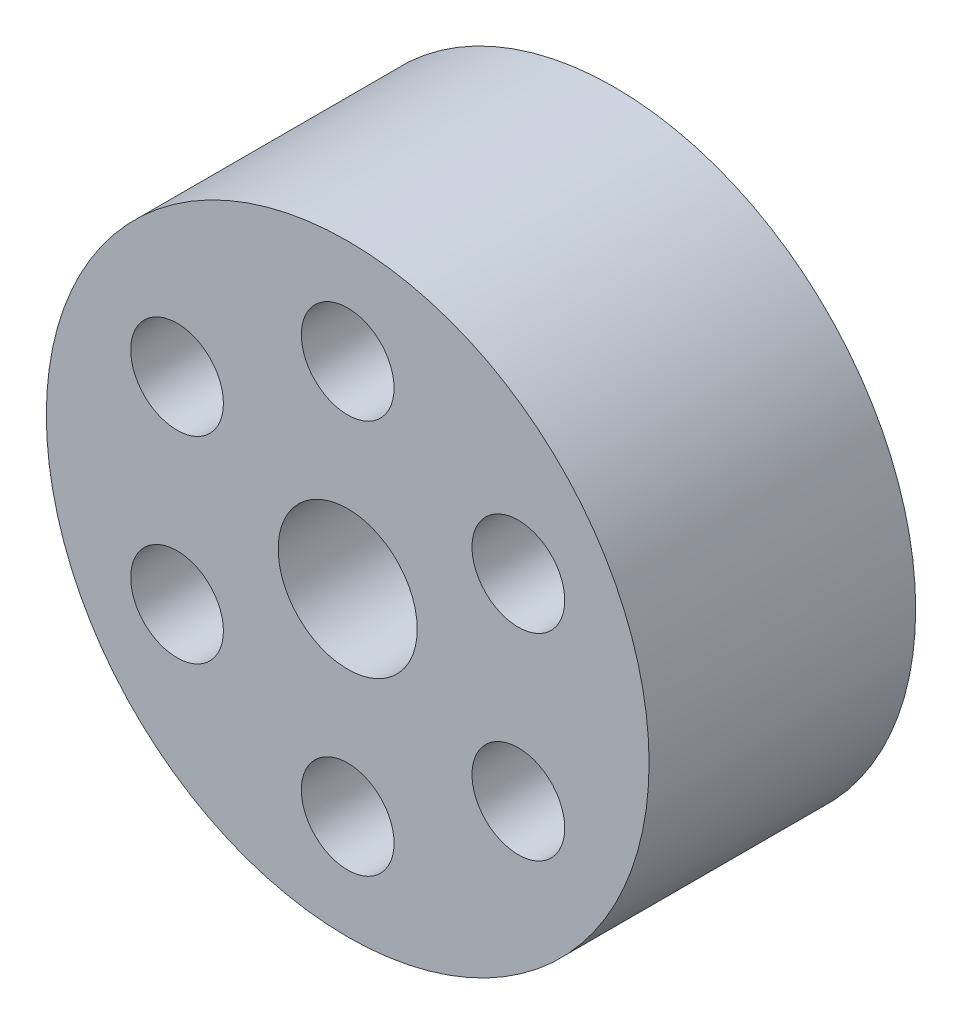
ISO-10303-21;
HEADER;
FILE_DESCRIPTION(('STEP AP214'),'2;1');
FILE_NAME('part.step','',(''),(''),'','','');
FILE_SCHEMA(('AUTOMOTIVE_DESIGN { 1 0 10303 214 1 1 1 1 }'));
ENDSEC;
DATA;
#1=APPLICATION_CONTEXT('core data for automotive mechanical design processes');
#2=APPLICATION_PROTOCOL_DEFINITION('international standard','automotive_design',2000,#1);
#3=PRODUCT_CONTEXT('',#1,'mechanical');
#4=PRODUCT('Part','Part','',(#3));
#5=PRODUCT_RELATED_PRODUCT_CATEGORY('part','',(#4));
#6=PRODUCT_DEFINITION_FORMATION('','',#4);
#7=PRODUCT_DEFINITION_CONTEXT('part definition',#1,'design');
#8=PRODUCT_DEFINITION('design','',#6,#7);
#9=PRODUCT_DEFINITION_SHAPE('','',#8);
#10=(LENGTH_UNIT() NAMED_UNIT(*) SI_UNIT(.MILLI.,.METRE.));
#11=(NAMED_UNIT(*) PLANE_ANGLE_UNIT() SI_UNIT($,.RADIAN.));
#12=(NAMED_UNIT(*) SI_UNIT($,.STERADIAN.) SOLID_ANGLE_UNIT());
#13=UNCERTAINTY_MEASURE_WITH_UNIT(LENGTH_MEASURE(1.E-05),#10,'distance_accuracy_value','');
#14=(GEOMETRIC_REPRESENTATION_CONTEXT(3) GLOBAL_UNCERTAINTY_ASSIGNED_CONTEXT((#13)) GLOBAL_UNIT_ASSIGNED_CONTEXT((#10,
#11,#12)) REPRESENTATION_CONTEXT('',''));
#15=CARTESIAN_POINT('',(0.,0.,0.));
#16=DIRECTION('',(0.,0.,1.));
#17=DIRECTION('',(1.,0.,0.));
#18=AXIS2_PLACEMENT_3D('',#15,#16,#17);
#19=CARTESIAN_POINT('',(0.,0.,11.5));
#20=DIRECTION('',(0.,0.,-1.));
#21=DIRECTION('',(-1.,0.,0.));
#22=AXIS2_PLACEMENT_3D('',#19,#20,#21);
#23=CYLINDRICAL_SURFACE('',#22,13.);
#24=CARTESIAN_POINT('',(0.,0.,11.5));
#25=DIRECTION('',(0.,0.,1.));
#26=DIRECTION('',(1.,0.,0.));
#27=AXIS2_PLACEMENT_3D('',#24,#25,#26);
#28=CIRCLE('',#27,13.);
#29=CARTESIAN_POINT('',(13.,0.,11.5));
#30=VERTEX_POINT('',#29);
#31=EDGE_CURVE('E10',#30,#30,#28,.T.);
#32=ORIENTED_EDGE('',*,*,#31,.F.);
#33=EDGE_LOOP('',(#32));
#34=FACE_BOUND('',#33,.T.);
#35=CARTESIAN_POINT('',(0.,0.,0.));
#36=DIRECTION('',(0.,0.,1.));
#37=DIRECTION('',(1.,0.,0.));
#38=AXIS2_PLACEMENT_3D('',#35,#36,#37);
#39=CIRCLE('',#38,13.);
#40=CARTESIAN_POINT('',(13.,0.,0.));
#41=VERTEX_POINT('',#40);
#42=EDGE_CURVE('E43',#41,#41,#39,.T.);
#43=ORIENTED_EDGE('',*,*,#42,.T.);
#44=EDGE_LOOP('',(#43));
#45=FACE_BOUND('',#44,.T.);
#46=ADVANCED_FACE('F40',(#34,#45),#23,.T.);
#47=CARTESIAN_POINT('',(0.,0.,11.5));
#48=DIRECTION('',(0.,0.,1.));
#49=DIRECTION('',(1.,0.,0.));
#50=AXIS2_PLACEMENT_3D('',#47,#48,#49);
#51=PLANE('',#50);
#52=CARTESIAN_POINT('',(0.,0.,11.5));
#53=DIRECTION('',(0.,0.,1.));
#54=DIRECTION('',(1.,0.,0.));
#55=AXIS2_PLACEMENT_3D('',#52,#53,#54);
#56=CIRCLE('',#55,3.);
#57=CARTESIAN_POINT('',(3.,0.,11.5));
#58=VERTEX_POINT('',#57);
#59=EDGE_CURVE('E102',#58,#58,#56,.T.);
#60=ORIENTED_EDGE('',*,*,#59,.F.);
#61=EDGE_LOOP('',(#60));
#62=FACE_BOUND('',#61,.T.);
#63=CARTESIAN_POINT('',(0.,8.5,11.5));
#64=DIRECTION('',(0.,0.,1.));
#65=DIRECTION('',(1.,0.,0.));
#66=AXIS2_PLACEMENT_3D('',#63,#64,#65);
#67=CIRCLE('',#66,2.);
#68=CARTESIAN_POINT('',(2.,8.5,11.5));
#69=VERTEX_POINT('',#68);
#70=EDGE_CURVE('E58',#69,#69,#67,.T.);
#71=ORIENTED_EDGE('',*,*,#70,.F.);
#72=EDGE_LOOP('',(#71));
#73=FACE_BOUND('',#72,.T.);
#74=CARTESIAN_POINT('',(-7.36121593216773,4.25,11.5));
#75=DIRECTION('',(0.,0.,1.));
#76=DIRECTION('',(1.,0.,0.));
#77=AXIS2_PLACEMENT_3D('',#74,#75,#76);
#78=CIRCLE('',#77,2.);
#79=CARTESIAN_POINT('',(-5.36121593216773,4.25,11.5));
#80=VERTEX_POINT('',#79);
#81=EDGE_CURVE('E83',#80,#80,#78,.T.);
#82=ORIENTED_EDGE('',*,*,#81,.F.);
#83=EDGE_LOOP('',(#82));
#84=FACE_BOUND('',#83,.T.);
#85=CARTESIAN_POINT('',(0.,-8.5,11.5));
#86=DIRECTION('',(0.,0.,1.));
#87=DIRECTION('',(1.,0.,0.));
#88=AXIS2_PLACEMENT_3D('',#85,#86,#87);
#89=CIRCLE('',#88,2.);
#90=CARTESIAN_POINT('',(2.,-8.5,11.5));
#91=VERTEX_POINT('',#90);
#92=EDGE_CURVE('E75',#91,#91,#89,.T.);
#93=ORIENTED_EDGE('',*,*,#92,.F.);
#94=EDGE_LOOP('',(#93));
#95=FACE_BOUND('',#94,.T.);
#96=CARTESIAN_POINT('',(7.36121593216773,-4.25,11.5));
#97=DIRECTION('',(0.,0.,1.));
#98=DIRECTION('',(1.,0.,0.));
#99=AXIS2_PLACEMENT_3D('',#96,#97,#98);
#100=CIRCLE('',#99,2.);
#101=CARTESIAN_POINT('',(9.36121593216773,-4.25,11.5));
#102=VERTEX_POINT('',#101);
#103=EDGE_CURVE('E66',#102,#102,#100,.T.);
#104=ORIENTED_EDGE('',*,*,#103,.F.);
#105=EDGE_LOOP('',(#104));
#106=FACE_BOUND('',#105,.T.);
#107=CARTESIAN_POINT('',(7.36121593216773,4.25,11.5));
#108=DIRECTION('',(0.,0.,1.));
#109=DIRECTION('',(1.,0.,0.));
#110=AXIS2_PLACEMENT_3D('',#107,#108,#109);
#111=CIRCLE('',#110,2.);
#112=CARTESIAN_POINT('',(9.36121593216773,4.25,11.5));
#113=VERTEX_POINT('',#112);
#114=EDGE_CURVE('E67',#113,#113,#111,.T.);
#115=ORIENTED_EDGE('',*,*,#114,.F.);
#116=EDGE_LOOP('',(#115));
#117=FACE_BOUND('',#116,.T.);
#118=CARTESIAN_POINT('',(-7.36121593216773,-4.25,11.5));
#119=DIRECTION('',(0.,0.,1.));
#120=DIRECTION('',(1.,0.,0.));
#121=AXIS2_PLACEMENT_3D('',#118,#119,#120);
#122=CIRCLE('',#121,2.);
#123=CARTESIAN_POINT('',(-5.36121593216773,-4.25,11.5));
#124=VERTEX_POINT('',#123);
#125=EDGE_CURVE('E54',#124,#124,#122,.T.);
#126=ORIENTED_EDGE('',*,*,#125,.F.);
#127=EDGE_LOOP('',(#126));
#128=FACE_BOUND('',#127,.T.);
#129=ORIENTED_EDGE('',*,*,#31,.T.);
#130=EDGE_LOOP('',(#129));
#131=FACE_BOUND('',#130,.T.);
#132=ADVANCED_FACE('F119',(#62,#73,#84,#95,#106,#117,#128,#131),#51,.T.);
#133=CARTESIAN_POINT('',(0.,0.,0.));
#134=DIRECTION('',(0.,0.,1.));
#135=DIRECTION('',(1.,0.,0.));
#136=AXIS2_PLACEMENT_3D('',#133,#134,#135);
#137=PLANE('',#136);
#138=ORIENTED_EDGE('',*,*,#42,.F.);
#139=EDGE_LOOP('',(#138));
#140=FACE_BOUND('',#139,.T.);
#141=ADVANCED_FACE('F122',(#140),#137,.F.);
#142=CARTESIAN_POINT('',(-7.36121593216773,-4.25,6.5));
#143=DIRECTION('',(0.,0.,1.));
#144=DIRECTION('',(1.,0.,0.));
#145=AXIS2_PLACEMENT_3D('',#142,#143,#144);
#146=CYLINDRICAL_SURFACE('',#145,2.);
#147=CARTESIAN_POINT('',(-7.36121593216773,-4.25,6.5));
#148=DIRECTION('',(0.,0.,1.));
#149=DIRECTION('',(1.,0.,0.));
#150=AXIS2_PLACEMENT_3D('',#147,#148,#149);
#151=CIRCLE('',#150,2.);
#152=CARTESIAN_POINT('',(-5.36121593216773,-4.25,6.5));
#153=VERTEX_POINT('',#152);
#154=EDGE_CURVE('E52',#153,#153,#151,.T.);
#155=ORIENTED_EDGE('',*,*,#154,.F.);
#156=EDGE_LOOP('',(#155));
#157=FACE_BOUND('',#156,.T.);
#158=ORIENTED_EDGE('',*,*,#125,.T.);
#159=EDGE_LOOP('',(#158));
#160=FACE_BOUND('',#159,.T.);
#161=ADVANCED_FACE('F136',(#157,#160),#146,.F.);
#162=CARTESIAN_POINT('',(-7.36121593216773,-4.25,6.5));
#163=DIRECTION('',(0.,0.,1.));
#164=DIRECTION('',(1.,0.,0.));
#165=AXIS2_PLACEMENT_3D('',#162,#163,#164);
#166=PLANE('',#165);
#167=ORIENTED_EDGE('',*,*,#154,.T.);
#168=EDGE_LOOP('',(#167));
#169=FACE_BOUND('',#168,.T.);
#170=ADVANCED_FACE('F138',(#169),#166,.T.);
#171=CARTESIAN_POINT('',(7.36121593216773,4.25,6.5));
#172=DIRECTION('',(0.,0.,1.));
#173=DIRECTION('',(1.,0.,0.));
#174=AXIS2_PLACEMENT_3D('',#171,#172,#173);
#175=CYLINDRICAL_SURFACE('',#174,2.);
#176=CARTESIAN_POINT('',(7.36121593216773,4.25,6.5));
#177=DIRECTION('',(0.,0.,1.));
#178=DIRECTION('',(1.,0.,0.));
#179=AXIS2_PLACEMENT_3D('',#176,#177,#178);
#180=CIRCLE('',#179,2.);
#181=CARTESIAN_POINT('',(9.36121593216773,4.25,6.5));
#182=VERTEX_POINT('',#181);
#183=EDGE_CURVE('E94',#182,#182,#180,.T.);
#184=ORIENTED_EDGE('',*,*,#183,.F.);
#185=EDGE_LOOP('',(#184));
#186=FACE_BOUND('',#185,.T.);
#187=ORIENTED_EDGE('',*,*,#114,.T.);
#188=EDGE_LOOP('',(#187));
#189=FACE_BOUND('',#188,.T.);
#190=ADVANCED_FACE('F145',(#186,#189),#175,.F.);
#191=CARTESIAN_POINT('',(7.36121593216773,4.25,6.5));
#192=DIRECTION('',(0.,0.,1.));
#193=DIRECTION('',(1.,0.,0.));
#194=AXIS2_PLACEMENT_3D('',#191,#192,#193);
#195=PLANE('',#194);
#196=ORIENTED_EDGE('',*,*,#183,.T.);
#197=EDGE_LOOP('',(#196));
#198=FACE_BOUND('',#197,.T.);
#199=ADVANCED_FACE('F188',(#198),#195,.T.);
#200=CARTESIAN_POINT('',(7.36121593216773,-4.25,6.5));
#201=DIRECTION('',(0.,0.,1.));
#202=DIRECTION('',(1.,0.,0.));
#203=AXIS2_PLACEMENT_3D('',#200,#201,#202);
#204=CYLINDRICAL_SURFACE('',#203,2.);
#205=CARTESIAN_POINT('',(7.36121593216773,-4.25,6.5));
#206=DIRECTION('',(0.,0.,1.));
#207=DIRECTION('',(1.,0.,0.));
#208=AXIS2_PLACEMENT_3D('',#205,#206,#207);
#209=CIRCLE('',#208,2.);
#210=CARTESIAN_POINT('',(9.36121593216773,-4.25,6.5));
#211=VERTEX_POINT('',#210);
#212=EDGE_CURVE('E62',#211,#211,#209,.T.);
#213=ORIENTED_EDGE('',*,*,#212,.F.);
#214=EDGE_LOOP('',(#213));
#215=FACE_BOUND('',#214,.T.);
#216=ORIENTED_EDGE('',*,*,#103,.T.);
#217=EDGE_LOOP('',(#216));
#218=FACE_BOUND('',#217,.T.);
#219=ADVANCED_FACE('F199',(#215,#218),#204,.F.);
#220=CARTESIAN_POINT('',(7.36121593216773,-4.25,6.5));
#221=DIRECTION('',(0.,0.,1.));
#222=DIRECTION('',(1.,0.,0.));
#223=AXIS2_PLACEMENT_3D('',#220,#221,#222);
#224=PLANE('',#223);
#225=ORIENTED_EDGE('',*,*,#212,.T.);
#226=EDGE_LOOP('',(#225));
#227=FACE_BOUND('',#226,.T.);
#228=ADVANCED_FACE('F210',(#227),#224,.T.);
#229=CARTESIAN_POINT('',(0.,-8.5,6.5));
#230=DIRECTION('',(0.,0.,1.));
#231=DIRECTION('',(1.,0.,0.));
#232=AXIS2_PLACEMENT_3D('',#229,#230,#231);
#233=CYLINDRICAL_SURFACE('',#232,2.);
#234=CARTESIAN_POINT('',(0.,-8.5,6.5));
#235=DIRECTION('',(0.,0.,1.));
#236=DIRECTION('',(1.,0.,0.));
#237=AXIS2_PLACEMENT_3D('',#234,#235,#236);
#238=CIRCLE('',#237,2.);
#239=CARTESIAN_POINT('',(2.,-8.5,6.5));
#240=VERTEX_POINT('',#239);
#241=EDGE_CURVE('E71',#240,#240,#238,.T.);
#242=ORIENTED_EDGE('',*,*,#241,.F.);
#243=EDGE_LOOP('',(#242));
#244=FACE_BOUND('',#243,.T.);
#245=ORIENTED_EDGE('',*,*,#92,.T.);
#246=EDGE_LOOP('',(#245));
#247=FACE_BOUND('',#246,.T.);
#248=ADVANCED_FACE('F221',(#244,#247),#233,.F.);
#249=CARTESIAN_POINT('',(0.,-8.5,6.5));
#250=DIRECTION('',(0.,0.,1.));
#251=DIRECTION('',(1.,0.,0.));
#252=AXIS2_PLACEMENT_3D('',#249,#250,#251);
#253=PLANE('',#252);
#254=ORIENTED_EDGE('',*,*,#241,.T.);
#255=EDGE_LOOP('',(#254));
#256=FACE_BOUND('',#255,.T.);
#257=ADVANCED_FACE('F232',(#256),#253,.T.);
#258=CARTESIAN_POINT('',(-7.36121593216773,4.25,6.5));
#259=DIRECTION('',(0.,0.,1.));
#260=DIRECTION('',(1.,0.,0.));
#261=AXIS2_PLACEMENT_3D('',#258,#259,#260);
#262=CYLINDRICAL_SURFACE('',#261,2.);
#263=CARTESIAN_POINT('',(-7.36121593216773,4.25,6.5));
#264=DIRECTION('',(0.,0.,1.));
#265=DIRECTION('',(1.,0.,0.));
#266=AXIS2_PLACEMENT_3D('',#263,#264,#265);
#267=CIRCLE('',#266,2.);
#268=CARTESIAN_POINT('',(-5.36121593216773,4.25,6.5));
#269=VERTEX_POINT('',#268);
#270=EDGE_CURVE('E79',#269,#269,#267,.T.);
#271=ORIENTED_EDGE('',*,*,#270,.F.);
#272=EDGE_LOOP('',(#271));
#273=FACE_BOUND('',#272,.T.);
#274=ORIENTED_EDGE('',*,*,#81,.T.);
#275=EDGE_LOOP('',(#274));
#276=FACE_BOUND('',#275,.T.);
#277=ADVANCED_FACE('F243',(#273,#276),#262,.F.);
#278=CARTESIAN_POINT('',(-7.36121593216773,4.25,6.5));
#279=DIRECTION('',(0.,0.,1.));
#280=DIRECTION('',(1.,0.,0.));
#281=AXIS2_PLACEMENT_3D('',#278,#279,#280);
#282=PLANE('',#281);
#283=ORIENTED_EDGE('',*,*,#270,.T.);
#284=EDGE_LOOP('',(#283));
#285=FACE_BOUND('',#284,.T.);
#286=ADVANCED_FACE('F254',(#285),#282,.T.);
#287=CARTESIAN_POINT('',(0.,8.5,6.5));
#288=DIRECTION('',(0.,0.,1.));
#289=DIRECTION('',(1.,0.,0.));
#290=AXIS2_PLACEMENT_3D('',#287,#288,#289);
#291=CYLINDRICAL_SURFACE('',#290,2.);
#292=CARTESIAN_POINT('',(0.,8.5,6.5));
#293=DIRECTION('',(0.,0.,1.));
#294=DIRECTION('',(1.,0.,0.));
#295=AXIS2_PLACEMENT_3D('',#292,#293,#294);
#296=CIRCLE('',#295,2.);
#297=CARTESIAN_POINT('',(2.,8.5,6.5));
#298=VERTEX_POINT('',#297);
#299=EDGE_CURVE('E87',#298,#298,#296,.T.);
#300=ORIENTED_EDGE('',*,*,#299,.F.);
#301=EDGE_LOOP('',(#300));
#302=FACE_BOUND('',#301,.T.);
#303=ORIENTED_EDGE('',*,*,#70,.T.);
#304=EDGE_LOOP('',(#303));
#305=FACE_BOUND('',#304,.T.);
#306=ADVANCED_FACE('F265',(#302,#305),#291,.F.);
#307=CARTESIAN_POINT('',(0.,8.5,6.5));
#308=DIRECTION('',(0.,0.,1.));
#309=DIRECTION('',(1.,0.,0.));
#310=AXIS2_PLACEMENT_3D('',#307,#308,#309);
#311=PLANE('',#310);
#312=ORIENTED_EDGE('',*,*,#299,.T.);
#313=EDGE_LOOP('',(#312));
#314=FACE_BOUND('',#313,.T.);
#315=ADVANCED_FACE('F115',(#314),#311,.T.);
#316=CARTESIAN_POINT('',(0.,0.,7.));
#317=DIRECTION('',(0.,0.,1.));
#318=DIRECTION('',(1.,0.,0.));
#319=AXIS2_PLACEMENT_3D('',#316,#317,#318);
#320=CYLINDRICAL_SURFACE('',#319,3.);
#321=CARTESIAN_POINT('',(0.,0.,7.));
#322=DIRECTION('',(0.,0.,1.));
#323=DIRECTION('',(1.,0.,0.));
#324=AXIS2_PLACEMENT_3D('',#321,#322,#323);
#325=CIRCLE('',#324,3.);
#326=CARTESIAN_POINT('',(3.,0.,7.));
#327=VERTEX_POINT('',#326);
#328=EDGE_CURVE('E98',#327,#327,#325,.T.);
#329=ORIENTED_EDGE('',*,*,#328,.F.);
#330=EDGE_LOOP('',(#329));
#331=FACE_BOUND('',#330,.T.);
#332=ORIENTED_EDGE('',*,*,#59,.T.);
#333=EDGE_LOOP('',(#332));
#334=FACE_BOUND('',#333,.T.);
#335=ADVANCED_FACE('F112',(#331,#334),#320,.F.);
#336=CARTESIAN_POINT('',(0.,0.,7.));
#337=DIRECTION('',(0.,0.,1.));
#338=DIRECTION('',(1.,0.,0.));
#339=AXIS2_PLACEMENT_3D('',#336,#337,#338);
#340=PLANE('',#339);
#341=ORIENTED_EDGE('',*,*,#328,.T.);
#342=EDGE_LOOP('',(#341));
#343=FACE_BOUND('',#342,.T.);
#344=ADVANCED_FACE('F110',(#343),#340,.T.);
#345=CLOSED_SHELL('',(#46,#132,#141,#161,#170,#190,#199,#219,#228,#248,#257,#277,#286,#306,#315,
#335,#344));
#346=MANIFOLD_SOLID_BREP('B2',#345);
#347=ADVANCED_BREP_SHAPE_REPRESENTATION('',(#18,#346),#14);
#348=SHAPE_DEFINITION_REPRESENTATION(#9,#347);
ENDSEC;
END-ISO-10303-21;
